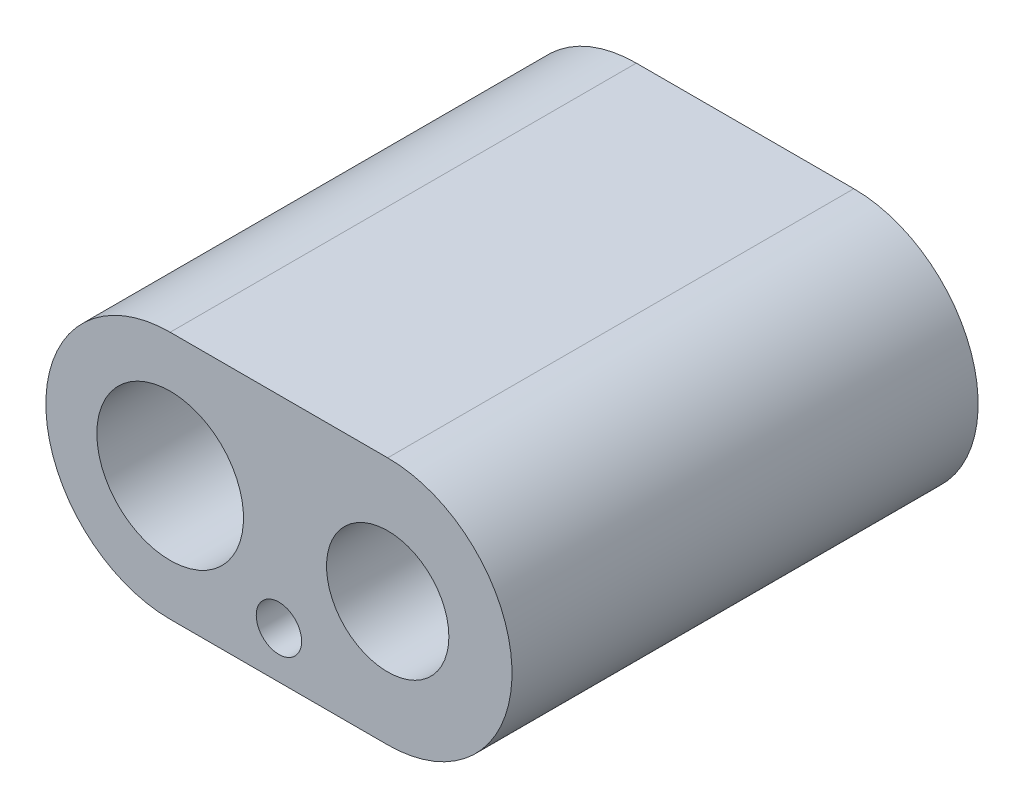
ISO-10303-21;
HEADER;
FILE_DESCRIPTION(('STEP AP214'),'2;1');
FILE_NAME('part.step','',(''),(''),'','','');
FILE_SCHEMA(('AUTOMOTIVE_DESIGN { 1 0 10303 214 1 1 1 1 }'));
ENDSEC;
DATA;
#1=APPLICATION_CONTEXT('core data for automotive mechanical design processes');
#2=APPLICATION_PROTOCOL_DEFINITION('international standard','automotive_design',2000,#1);
#3=PRODUCT_CONTEXT('',#1,'mechanical');
#4=PRODUCT('Part','Part','',(#3));
#5=PRODUCT_RELATED_PRODUCT_CATEGORY('part','',(#4));
#6=PRODUCT_DEFINITION_FORMATION('','',#4);
#7=PRODUCT_DEFINITION_CONTEXT('part definition',#1,'design');
#8=PRODUCT_DEFINITION('design','',#6,#7);
#9=PRODUCT_DEFINITION_SHAPE('','',#8);
#10=(LENGTH_UNIT() NAMED_UNIT(*) SI_UNIT(.MILLI.,.METRE.));
#11=(NAMED_UNIT(*) PLANE_ANGLE_UNIT() SI_UNIT($,.RADIAN.));
#12=(NAMED_UNIT(*) SI_UNIT($,.STERADIAN.) SOLID_ANGLE_UNIT());
#13=UNCERTAINTY_MEASURE_WITH_UNIT(LENGTH_MEASURE(1.E-05),#10,'distance_accuracy_value','');
#14=(GEOMETRIC_REPRESENTATION_CONTEXT(3) GLOBAL_UNCERTAINTY_ASSIGNED_CONTEXT((#13)) GLOBAL_UNIT_ASSIGNED_CONTEXT((#10,
#11,#12)) REPRESENTATION_CONTEXT('',''));
#15=CARTESIAN_POINT('',(0.,0.,0.));
#16=DIRECTION('',(0.,0.,1.));
#17=DIRECTION('',(1.,0.,0.));
#18=AXIS2_PLACEMENT_3D('',#15,#16,#17);
#19=CARTESIAN_POINT('',(8.89,0.,19.05));
#20=DIRECTION('',(0.,0.,-1.));
#21=DIRECTION('',(-1.,0.,0.));
#22=AXIS2_PLACEMENT_3D('',#19,#20,#21);
#23=CYLINDRICAL_SURFACE('',#22,1.5875);
#24=CARTESIAN_POINT('',(8.89,0.,0.));
#25=DIRECTION('',(0.,0.,1.));
#26=DIRECTION('',(1.,0.,0.));
#27=AXIS2_PLACEMENT_3D('',#24,#25,#26);
#28=CIRCLE('',#27,1.5875);
#29=CARTESIAN_POINT('',(7.3025,0.,0.));
#30=VERTEX_POINT('',#29);
#31=EDGE_CURVE('E127',#30,#30,#28,.T.);
#32=CARTESIAN_POINT('',(8.89,0.,13.5017146851374));
#33=DIRECTION('',(0.,0.,-1.));
#34=DIRECTION('',(-1.,0.,0.));
#35=AXIS2_PLACEMENT_3D('',#32,#33,#34);
#36=CIRCLE('',#35,1.5875);
#37=CARTESIAN_POINT('',(7.3025,0.,13.5017146851374));
#38=VERTEX_POINT('',#37);
#39=EDGE_CURVE('E141',#38,#38,#36,.T.);
#40=CARTESIAN_POINT('',(7.3025,0.,0.));
#41=CARTESIAN_POINT('',(7.3025,0.,0.140642861303514));
#42=CARTESIAN_POINT('',(7.3025,0.,0.281285722607029));
#43=CARTESIAN_POINT('',(7.3025,0.,0.562571445214058));
#44=CARTESIAN_POINT('',(7.3025,0.,0.703214306517572));
#45=CARTESIAN_POINT('',(7.3025,0.,0.9845000291246));
#46=CARTESIAN_POINT('',(7.3025,0.,1.12514289042811));
#47=CARTESIAN_POINT('',(7.3025,0.,1.40642861303514));
#48=CARTESIAN_POINT('',(7.3025,0.,1.54707147433866));
#49=CARTESIAN_POINT('',(7.3025,0.,1.82835719694568));
#50=CARTESIAN_POINT('',(7.3025,0.,1.9690000582492));
#51=CARTESIAN_POINT('',(7.3025,0.,2.25028578085623));
#52=CARTESIAN_POINT('',(7.3025,0.,2.39092864215974));
#53=CARTESIAN_POINT('',(7.3025,0.,2.67221436476677));
#54=CARTESIAN_POINT('',(7.3025,0.,2.81285722607028));
#55=CARTESIAN_POINT('',(7.3025,0.,3.09414294867731));
#56=CARTESIAN_POINT('',(7.3025,0.,3.23478580998083));
#57=CARTESIAN_POINT('',(7.3025,0.,3.51607153258785));
#58=CARTESIAN_POINT('',(7.3025,0.,3.65671439389137));
#59=CARTESIAN_POINT('',(7.3025,0.,3.9380001164984));
#60=CARTESIAN_POINT('',(7.3025,0.,4.07864297780191));
#61=CARTESIAN_POINT('',(7.3025,0.,4.35992870040894));
#62=CARTESIAN_POINT('',(7.3025,0.,4.50057156171245));
#63=CARTESIAN_POINT('',(7.3025,0.,4.78185728431948));
#64=CARTESIAN_POINT('',(7.3025,0.,4.92250014562299));
#65=CARTESIAN_POINT('',(7.3025,0.,5.20378586823002));
#66=CARTESIAN_POINT('',(7.3025,0.,5.34442872953354));
#67=CARTESIAN_POINT('',(7.3025,0.,5.62571445214057));
#68=CARTESIAN_POINT('',(7.3025,0.,5.76635731344408));
#69=CARTESIAN_POINT('',(7.3025,0.,6.04764303605111));
#70=CARTESIAN_POINT('',(7.3025,0.,6.18828589735462));
#71=CARTESIAN_POINT('',(7.3025,0.,6.46957161996165));
#72=CARTESIAN_POINT('',(7.3025,0.,6.61021448126516));
#73=CARTESIAN_POINT('',(7.3025,0.,6.89150020387219));
#74=CARTESIAN_POINT('',(7.3025,0.,7.03214306517571));
#75=CARTESIAN_POINT('',(7.3025,0.,7.31342878778274));
#76=CARTESIAN_POINT('',(7.3025,0.,7.45407164908625));
#77=CARTESIAN_POINT('',(7.3025,0.,7.73535737169328));
#78=CARTESIAN_POINT('',(7.3025,0.,7.87600023299679));
#79=CARTESIAN_POINT('',(7.3025,0.,8.15728595560382));
#80=CARTESIAN_POINT('',(7.3025,0.,8.29792881690734));
#81=CARTESIAN_POINT('',(7.3025,0.,8.57921453951436));
#82=CARTESIAN_POINT('',(7.3025,0.,8.71985740081788));
#83=CARTESIAN_POINT('',(7.3025,0.,9.00114312342491));
#84=CARTESIAN_POINT('',(7.3025,0.,9.14178598472842));
#85=CARTESIAN_POINT('',(7.3025,0.,9.42307170733545));
#86=CARTESIAN_POINT('',(7.3025,0.,9.56371456863896));
#87=CARTESIAN_POINT('',(7.3025,0.,9.84500029124599));
#88=CARTESIAN_POINT('',(7.3025,0.,9.98564315254951));
#89=CARTESIAN_POINT('',(7.3025,0.,10.2669288751565));
#90=CARTESIAN_POINT('',(7.3025,0.,10.40757173646));
#91=CARTESIAN_POINT('',(7.3025,0.,10.6888574590671));
#92=CARTESIAN_POINT('',(7.3025,0.,10.8295003203706));
#93=CARTESIAN_POINT('',(7.3025,0.,11.1107860429776));
#94=CARTESIAN_POINT('',(7.3025,0.,11.2514289042811));
#95=CARTESIAN_POINT('',(7.3025,0.,11.5327146268882));
#96=CARTESIAN_POINT('',(7.3025,0.,11.6733574881917));
#97=CARTESIAN_POINT('',(7.3025,0.,11.9546432107987));
#98=CARTESIAN_POINT('',(7.3025,0.,12.0952860721022));
#99=CARTESIAN_POINT('',(7.3025,0.,12.3765717947092));
#100=CARTESIAN_POINT('',(7.3025,0.,12.5172146560128));
#101=CARTESIAN_POINT('',(7.3025,0.,12.7985003786198));
#102=CARTESIAN_POINT('',(7.3025,0.,12.9391432399233));
#103=CARTESIAN_POINT('',(7.3025,0.,13.2204289625303));
#104=CARTESIAN_POINT('',(7.3025,0.,13.3610718238338));
#105=CARTESIAN_POINT('',(7.3025,0.,13.5017146851374));
#106=B_SPLINE_CURVE_WITH_KNOTS('',3,(#40,#41,#42,#43,#44,#45,#46,#47,#48,#49,#50,#51,#52,#53,
#54,#55,#56,#57,#58,#59,#60,#61,#62,#63,#64,#65,#66,#67,#68,#69,#70,#71,#72,#73,#74,#75,#76,#77,
#78,#79,#80,#81,#82,#83,#84,#85,#86,#87,#88,#89,#90,#91,#92,#93,#94,#95,#96,#97,#98,#99,#100,
#101,#102,#103,#104,#105),.UNSPECIFIED.,.F.,.F.,(4,2,2,2,2,2,2,2,2,2,2,2,2,2,2,2,2,2,2,2,2,2,2,
2,2,2,2,2,2,2,2,2,4),(0.,0.421928583910543,0.843857167821087,1.26578575173163,1.68771433564217,
2.10964291955271,2.53157150346325,2.9535000873738,3.37542867128434,3.79735725519488,
4.21928583910542,4.64121442301597,5.06314300692651,5.48507159083705,5.90700017474759,
6.32892875865814,6.75085734256868,7.17278592647922,7.59471451038976,8.01664309430031,
8.43857167821085,8.86050026212139,9.28242884603193,9.70435742994248,10.126286013853,
10.5482145977636,10.9701431816741,11.3920717655846,11.8140003494952,12.2359289334057,
12.6578575173163,13.0797861012268,13.5017146851374),.UNSPECIFIED.);
#107=EDGE_CURVE('BSEAM44',#30,#38,#106,.T.);
#108=ORIENTED_EDGE('',*,*,#31,.F.);
#109=ORIENTED_EDGE('',*,*,#39,.F.);
#110=ORIENTED_EDGE('',*,*,#107,.T.);
#111=ORIENTED_EDGE('',*,*,#107,.F.);
#112=EDGE_LOOP('',(#108,#110,#109,#111));
#113=FACE_BOUND('',#112,.T.);
#114=ADVANCED_FACE('F44',(#113),#23,.F.);
#115=CARTESIAN_POINT('',(0.,0.,19.05));
#116=DIRECTION('',(0.,0.,1.));
#117=DIRECTION('',(1.,0.,0.));
#118=AXIS2_PLACEMENT_3D('',#115,#116,#117);
#119=PLANE('',#118);
#120=CARTESIAN_POINT('',(8.89,0.,19.05));
#121=DIRECTION('',(0.,0.,1.));
#122=DIRECTION('',(1.,0.,0.));
#123=AXIS2_PLACEMENT_3D('',#120,#121,#122);
#124=CIRCLE('',#123,2.5);
#125=CARTESIAN_POINT('',(11.39,0.,19.05));
#126=VERTEX_POINT('',#125);
#127=EDGE_CURVE('E136',#126,#126,#124,.T.);
#128=ORIENTED_EDGE('',*,*,#127,.F.);
#129=EDGE_LOOP('',(#128));
#130=FACE_BOUND('',#129,.T.);
#131=CARTESIAN_POINT('',(0.,0.,19.05));
#132=DIRECTION('',(0.,0.,1.));
#133=DIRECTION('',(1.,0.,0.));
#134=AXIS2_PLACEMENT_3D('',#131,#132,#133);
#135=CIRCLE('',#134,5.08);
#136=CARTESIAN_POINT('',(0.,5.08,19.05));
#137=VERTEX_POINT('',#136);
#138=CARTESIAN_POINT('',(0.,-5.08,19.05));
#139=VERTEX_POINT('',#138);
#140=EDGE_CURVE('E97',#137,#139,#135,.T.);
#141=ORIENTED_EDGE('',*,*,#140,.T.);
#142=DIRECTION('',(1.,0.,0.));
#143=VECTOR('',#142,1.);
#144=CARTESIAN_POINT('',(0.,-5.08,19.05));
#145=LINE('',#144,#143);
#146=CARTESIAN_POINT('',(8.89,-5.08,19.05));
#147=VERTEX_POINT('',#146);
#148=EDGE_CURVE('E91',#139,#147,#145,.T.);
#149=ORIENTED_EDGE('',*,*,#148,.T.);
#150=CARTESIAN_POINT('',(8.89,0.,19.05));
#151=DIRECTION('',(0.,0.,1.));
#152=DIRECTION('',(1.,0.,0.));
#153=AXIS2_PLACEMENT_3D('',#150,#151,#152);
#154=CIRCLE('',#153,5.08);
#155=CARTESIAN_POINT('',(8.89,5.08,19.05));
#156=VERTEX_POINT('',#155);
#157=EDGE_CURVE('E95',#147,#156,#154,.T.);
#158=ORIENTED_EDGE('',*,*,#157,.T.);
#159=DIRECTION('',(-1.,0.,0.));
#160=VECTOR('',#159,1.);
#161=CARTESIAN_POINT('',(0.,5.08,19.05));
#162=LINE('',#161,#160);
#163=EDGE_CURVE('E61',#156,#137,#162,.T.);
#164=ORIENTED_EDGE('',*,*,#163,.T.);
#165=EDGE_LOOP('',(#141,#149,#158,#164));
#166=FACE_BOUND('',#165,.T.);
#167=CARTESIAN_POINT('',(0.,0.,19.05));
#168=DIRECTION('',(0.,0.,1.));
#169=DIRECTION('',(1.,0.,0.));
#170=AXIS2_PLACEMENT_3D('',#167,#168,#169);
#171=CIRCLE('',#170,2.9972);
#172=CARTESIAN_POINT('',(-2.9972,0.,19.05));
#173=VERTEX_POINT('',#172);
#174=EDGE_CURVE('E112',#173,#173,#171,.T.);
#175=ORIENTED_EDGE('',*,*,#174,.F.);
#176=EDGE_LOOP('',(#175));
#177=FACE_BOUND('',#176,.T.);
#178=CARTESIAN_POINT('',(4.445,-3.175,19.05));
#179=DIRECTION('',(0.,0.,1.));
#180=DIRECTION('',(1.,0.,0.));
#181=AXIS2_PLACEMENT_3D('',#178,#179,#180);
#182=CIRCLE('',#181,0.9271);
#183=CARTESIAN_POINT('',(3.5179,-3.175,19.05));
#184=VERTEX_POINT('',#183);
#185=EDGE_CURVE('E132',#184,#184,#182,.T.);
#186=ORIENTED_EDGE('',*,*,#185,.F.);
#187=EDGE_LOOP('',(#186));
#188=FACE_BOUND('',#187,.T.);
#189=ADVANCED_FACE('F92',(#130,#166,#177,#188),#119,.T.);
#190=CARTESIAN_POINT('',(0.,0.,0.));
#191=DIRECTION('',(0.,0.,1.));
#192=DIRECTION('',(1.,0.,0.));
#193=AXIS2_PLACEMENT_3D('',#190,#191,#192);
#194=PLANE('',#193);
#195=ORIENTED_EDGE('',*,*,#31,.T.);
#196=EDGE_LOOP('',(#195));
#197=FACE_BOUND('',#196,.T.);
#198=CARTESIAN_POINT('',(0.,0.,0.));
#199=DIRECTION('',(0.,0.,1.));
#200=DIRECTION('',(1.,0.,0.));
#201=AXIS2_PLACEMENT_3D('',#198,#199,#200);
#202=CIRCLE('',#201,5.08);
#203=CARTESIAN_POINT('',(0.,5.08,0.));
#204=VERTEX_POINT('',#203);
#205=CARTESIAN_POINT('',(0.,-5.08,0.));
#206=VERTEX_POINT('',#205);
#207=EDGE_CURVE('E109',#204,#206,#202,.T.);
#208=ORIENTED_EDGE('',*,*,#207,.F.);
#209=DIRECTION('',(-1.,0.,0.));
#210=VECTOR('',#209,1.);
#211=CARTESIAN_POINT('',(0.,5.08,0.));
#212=LINE('',#211,#210);
#213=CARTESIAN_POINT('',(8.89,5.08,0.));
#214=VERTEX_POINT('',#213);
#215=EDGE_CURVE('E84',#214,#204,#212,.T.);
#216=ORIENTED_EDGE('',*,*,#215,.F.);
#217=CARTESIAN_POINT('',(8.89,0.,0.));
#218=DIRECTION('',(0.,0.,1.));
#219=DIRECTION('',(1.,0.,0.));
#220=AXIS2_PLACEMENT_3D('',#217,#218,#219);
#221=CIRCLE('',#220,5.08);
#222=CARTESIAN_POINT('',(8.89,-5.08,0.));
#223=VERTEX_POINT('',#222);
#224=EDGE_CURVE('E78',#223,#214,#221,.T.);
#225=ORIENTED_EDGE('',*,*,#224,.F.);
#226=DIRECTION('',(1.,0.,0.));
#227=VECTOR('',#226,1.);
#228=CARTESIAN_POINT('',(0.,-5.08,0.));
#229=LINE('',#228,#227);
#230=EDGE_CURVE('E101',#206,#223,#229,.T.);
#231=ORIENTED_EDGE('',*,*,#230,.F.);
#232=EDGE_LOOP('',(#208,#216,#225,#231));
#233=FACE_BOUND('',#232,.T.);
#234=CARTESIAN_POINT('',(0.,0.,0.));
#235=DIRECTION('',(0.,0.,1.));
#236=DIRECTION('',(1.,0.,0.));
#237=AXIS2_PLACEMENT_3D('',#234,#235,#236);
#238=CIRCLE('',#237,2.9972);
#239=CARTESIAN_POINT('',(-2.9972,0.,0.));
#240=VERTEX_POINT('',#239);
#241=EDGE_CURVE('E124',#240,#240,#238,.T.);
#242=ORIENTED_EDGE('',*,*,#241,.T.);
#243=EDGE_LOOP('',(#242));
#244=FACE_BOUND('',#243,.T.);
#245=CARTESIAN_POINT('',(4.445,-3.175,0.));
#246=DIRECTION('',(0.,0.,1.));
#247=DIRECTION('',(1.,0.,0.));
#248=AXIS2_PLACEMENT_3D('',#245,#246,#247);
#249=CIRCLE('',#248,0.9271);
#250=CARTESIAN_POINT('',(3.5179,-3.175,0.));
#251=VERTEX_POINT('',#250);
#252=EDGE_CURVE('E133',#251,#251,#249,.T.);
#253=ORIENTED_EDGE('',*,*,#252,.T.);
#254=EDGE_LOOP('',(#253));
#255=FACE_BOUND('',#254,.T.);
#256=ADVANCED_FACE('F120',(#197,#233,#244,#255),#194,.F.);
#257=CARTESIAN_POINT('',(0.,0.,19.05));
#258=DIRECTION('',(0.,0.,-1.));
#259=DIRECTION('',(-1.,0.,0.));
#260=AXIS2_PLACEMENT_3D('',#257,#258,#259);
#261=CYLINDRICAL_SURFACE('',#260,5.08);
#262=ORIENTED_EDGE('',*,*,#207,.T.);
#263=DIRECTION('',(0.,0.,-1.));
#264=VECTOR('',#263,1.);
#265=CARTESIAN_POINT('',(0.,-5.08,19.05));
#266=LINE('',#265,#264);
#267=EDGE_CURVE('E13',#139,#206,#266,.T.);
#268=ORIENTED_EDGE('',*,*,#267,.F.);
#269=ORIENTED_EDGE('',*,*,#140,.F.);
#270=DIRECTION('',(0.,0.,-1.));
#271=VECTOR('',#270,1.);
#272=CARTESIAN_POINT('',(0.,5.08,19.05));
#273=LINE('',#272,#271);
#274=EDGE_CURVE('E105',#137,#204,#273,.T.);
#275=ORIENTED_EDGE('',*,*,#274,.T.);
#276=EDGE_LOOP('',(#262,#268,#269,#275));
#277=FACE_BOUND('',#276,.T.);
#278=ADVANCED_FACE('F46',(#277),#261,.T.);
#279=CARTESIAN_POINT('',(0.,-5.08,19.05));
#280=DIRECTION('',(0.,1.,0.));
#281=DIRECTION('',(0.,0.,1.));
#282=AXIS2_PLACEMENT_3D('',#279,#280,#281);
#283=PLANE('',#282);
#284=ORIENTED_EDGE('',*,*,#230,.T.);
#285=DIRECTION('',(0.,0.,-1.));
#286=VECTOR('',#285,1.);
#287=CARTESIAN_POINT('',(8.89,-5.08,19.05));
#288=LINE('',#287,#286);
#289=EDGE_CURVE('E53',#147,#223,#288,.T.);
#290=ORIENTED_EDGE('',*,*,#289,.F.);
#291=ORIENTED_EDGE('',*,*,#148,.F.);
#292=ORIENTED_EDGE('',*,*,#267,.T.);
#293=EDGE_LOOP('',(#284,#290,#291,#292));
#294=FACE_BOUND('',#293,.T.);
#295=ADVANCED_FACE('F100',(#294),#283,.F.);
#296=CARTESIAN_POINT('',(8.89,0.,19.05));
#297=DIRECTION('',(0.,0.,-1.));
#298=DIRECTION('',(-1.,0.,0.));
#299=AXIS2_PLACEMENT_3D('',#296,#297,#298);
#300=CYLINDRICAL_SURFACE('',#299,5.08);
#301=ORIENTED_EDGE('',*,*,#224,.T.);
#302=DIRECTION('',(0.,0.,-1.));
#303=VECTOR('',#302,1.);
#304=CARTESIAN_POINT('',(8.89,5.08,19.05));
#305=LINE('',#304,#303);
#306=EDGE_CURVE('E102',#156,#214,#305,.T.);
#307=ORIENTED_EDGE('',*,*,#306,.F.);
#308=ORIENTED_EDGE('',*,*,#157,.F.);
#309=ORIENTED_EDGE('',*,*,#289,.T.);
#310=EDGE_LOOP('',(#301,#307,#308,#309));
#311=FACE_BOUND('',#310,.T.);
#312=ADVANCED_FACE('F103',(#311),#300,.T.);
#313=CARTESIAN_POINT('',(0.,5.08,19.05));
#314=DIRECTION('',(0.,-1.,0.));
#315=DIRECTION('',(0.,0.,-1.));
#316=AXIS2_PLACEMENT_3D('',#313,#314,#315);
#317=PLANE('',#316);
#318=ORIENTED_EDGE('',*,*,#215,.T.);
#319=ORIENTED_EDGE('',*,*,#274,.F.);
#320=ORIENTED_EDGE('',*,*,#163,.F.);
#321=ORIENTED_EDGE('',*,*,#306,.T.);
#322=EDGE_LOOP('',(#318,#319,#320,#321));
#323=FACE_BOUND('',#322,.T.);
#324=ADVANCED_FACE('F117',(#323),#317,.F.);
#325=CARTESIAN_POINT('',(0.,0.,19.05));
#326=DIRECTION('',(0.,0.,-1.));
#327=DIRECTION('',(-1.,0.,0.));
#328=AXIS2_PLACEMENT_3D('',#325,#326,#327);
#329=CYLINDRICAL_SURFACE('',#328,2.9972);
#330=CARTESIAN_POINT('',(-2.9972,0.,19.05));
#331=CARTESIAN_POINT('',(-2.9972,0.,18.8515625));
#332=CARTESIAN_POINT('',(-2.9972,0.,18.653125));
#333=CARTESIAN_POINT('',(-2.9972,0.,18.25625));
#334=CARTESIAN_POINT('',(-2.9972,0.,18.0578125));
#335=CARTESIAN_POINT('',(-2.9972,0.,17.6609375));
#336=CARTESIAN_POINT('',(-2.9972,0.,17.4625));
#337=CARTESIAN_POINT('',(-2.9972,0.,17.065625));
#338=CARTESIAN_POINT('',(-2.9972,0.,16.8671875));
#339=CARTESIAN_POINT('',(-2.9972,0.,16.4703125));
#340=CARTESIAN_POINT('',(-2.9972,0.,16.271875));
#341=CARTESIAN_POINT('',(-2.9972,0.,15.875));
#342=CARTESIAN_POINT('',(-2.9972,0.,15.6765625));
#343=CARTESIAN_POINT('',(-2.9972,0.,15.2796875));
#344=CARTESIAN_POINT('',(-2.9972,0.,15.08125));
#345=CARTESIAN_POINT('',(-2.9972,0.,14.684375));
#346=CARTESIAN_POINT('',(-2.9972,0.,14.4859375));
#347=CARTESIAN_POINT('',(-2.9972,0.,14.0890625));
#348=CARTESIAN_POINT('',(-2.9972,0.,13.890625));
#349=CARTESIAN_POINT('',(-2.9972,0.,13.49375));
#350=CARTESIAN_POINT('',(-2.9972,0.,13.2953125));
#351=CARTESIAN_POINT('',(-2.9972,0.,12.8984375));
#352=CARTESIAN_POINT('',(-2.9972,0.,12.7));
#353=CARTESIAN_POINT('',(-2.9972,0.,12.303125));
#354=CARTESIAN_POINT('',(-2.9972,0.,12.1046875));
#355=CARTESIAN_POINT('',(-2.9972,0.,11.7078125));
#356=CARTESIAN_POINT('',(-2.9972,0.,11.509375));
#357=CARTESIAN_POINT('',(-2.9972,0.,11.1125));
#358=CARTESIAN_POINT('',(-2.9972,0.,10.9140625));
#359=CARTESIAN_POINT('',(-2.9972,0.,10.5171875));
#360=CARTESIAN_POINT('',(-2.9972,0.,10.31875));
#361=CARTESIAN_POINT('',(-2.9972,0.,9.921875));
#362=CARTESIAN_POINT('',(-2.9972,0.,9.7234375));
#363=CARTESIAN_POINT('',(-2.9972,0.,9.3265625));
#364=CARTESIAN_POINT('',(-2.9972,0.,9.128125));
#365=CARTESIAN_POINT('',(-2.9972,0.,8.73125));
#366=CARTESIAN_POINT('',(-2.9972,0.,8.5328125));
#367=CARTESIAN_POINT('',(-2.9972,0.,8.1359375));
#368=CARTESIAN_POINT('',(-2.9972,0.,7.9375));
#369=CARTESIAN_POINT('',(-2.9972,0.,7.540625));
#370=CARTESIAN_POINT('',(-2.9972,0.,7.3421875));
#371=CARTESIAN_POINT('',(-2.9972,0.,6.9453125));
#372=CARTESIAN_POINT('',(-2.9972,0.,6.746875));
#373=CARTESIAN_POINT('',(-2.9972,0.,6.35));
#374=CARTESIAN_POINT('',(-2.9972,0.,6.1515625));
#375=CARTESIAN_POINT('',(-2.9972,0.,5.7546875));
#376=CARTESIAN_POINT('',(-2.9972,0.,5.55625));
#377=CARTESIAN_POINT('',(-2.9972,0.,5.159375));
#378=CARTESIAN_POINT('',(-2.9972,0.,4.9609375));
#379=CARTESIAN_POINT('',(-2.9972,0.,4.5640625));
#380=CARTESIAN_POINT('',(-2.9972,0.,4.365625));
#381=CARTESIAN_POINT('',(-2.9972,0.,3.96875));
#382=CARTESIAN_POINT('',(-2.9972,0.,3.7703125));
#383=CARTESIAN_POINT('',(-2.9972,0.,3.3734375));
#384=CARTESIAN_POINT('',(-2.9972,0.,3.175));
#385=CARTESIAN_POINT('',(-2.9972,0.,2.778125));
#386=CARTESIAN_POINT('',(-2.9972,0.,2.5796875));
#387=CARTESIAN_POINT('',(-2.9972,0.,2.1828125));
#388=CARTESIAN_POINT('',(-2.9972,0.,1.984375));
#389=CARTESIAN_POINT('',(-2.9972,0.,1.5875));
#390=CARTESIAN_POINT('',(-2.9972,0.,1.3890625));
#391=CARTESIAN_POINT('',(-2.9972,0.,0.992187500000001));
#392=CARTESIAN_POINT('',(-2.9972,0.,0.793750000000001));
#393=CARTESIAN_POINT('',(-2.9972,0.,0.396875));
#394=CARTESIAN_POINT('',(-2.9972,0.,0.1984375));
#395=CARTESIAN_POINT('',(-2.9972,0.,0.));
#396=B_SPLINE_CURVE_WITH_KNOTS('',3,(#330,#331,#332,#333,#334,#335,#336,#337,#338,#339,#340,
#341,#342,#343,#344,#345,#346,#347,#348,#349,#350,#351,#352,#353,#354,#355,#356,#357,#358,#359,
#360,#361,#362,#363,#364,#365,#366,#367,#368,#369,#370,#371,#372,#373,#374,#375,#376,#377,#378,
#379,#380,#381,#382,#383,#384,#385,#386,#387,#388,#389,#390,#391,#392,#393,#394,#395),
.UNSPECIFIED.,.F.,.F.,(4,2,2,2,2,2,2,2,2,2,2,2,2,2,2,2,2,2,2,2,2,2,2,2,2,2,2,2,2,2,2,2,4),(0.,
0.595312499999997,1.190625,1.7859375,2.38125,2.9765625,3.571875,4.1671875,4.7625,5.3578125,
5.953125,6.5484375,7.14375,7.7390625,8.334375,8.9296875,9.525,10.1203125,10.715625,11.3109375,
11.90625,12.5015625,13.096875,13.6921875,14.2875,14.8828125,15.478125,16.0734375,16.66875,
17.2640625,17.859375,18.4546875,19.05),.UNSPECIFIED.);
#397=EDGE_CURVE('BSEAM174',#173,#240,#396,.T.);
#398=ORIENTED_EDGE('',*,*,#174,.T.);
#399=ORIENTED_EDGE('',*,*,#241,.F.);
#400=ORIENTED_EDGE('',*,*,#397,.T.);
#401=ORIENTED_EDGE('',*,*,#397,.F.);
#402=EDGE_LOOP('',(#398,#400,#399,#401));
#403=FACE_BOUND('',#402,.T.);
#404=ADVANCED_FACE('F174',(#403),#329,.F.);
#405=CARTESIAN_POINT('',(4.445,-3.175,19.05));
#406=DIRECTION('',(0.,0.,-1.));
#407=DIRECTION('',(-1.,0.,0.));
#408=AXIS2_PLACEMENT_3D('',#405,#406,#407);
#409=CYLINDRICAL_SURFACE('',#408,0.9271);
#410=CARTESIAN_POINT('',(3.5179,-3.175,19.05));
#411=CARTESIAN_POINT('',(3.5179,-3.175,18.8515625));
#412=CARTESIAN_POINT('',(3.5179,-3.175,18.653125));
#413=CARTESIAN_POINT('',(3.5179,-3.175,18.25625));
#414=CARTESIAN_POINT('',(3.5179,-3.175,18.0578125));
#415=CARTESIAN_POINT('',(3.5179,-3.175,17.6609375));
#416=CARTESIAN_POINT('',(3.5179,-3.175,17.4625));
#417=CARTESIAN_POINT('',(3.5179,-3.175,17.065625));
#418=CARTESIAN_POINT('',(3.5179,-3.175,16.8671875));
#419=CARTESIAN_POINT('',(3.5179,-3.175,16.4703125));
#420=CARTESIAN_POINT('',(3.5179,-3.175,16.271875));
#421=CARTESIAN_POINT('',(3.5179,-3.175,15.875));
#422=CARTESIAN_POINT('',(3.5179,-3.175,15.6765625));
#423=CARTESIAN_POINT('',(3.5179,-3.175,15.2796875));
#424=CARTESIAN_POINT('',(3.5179,-3.175,15.08125));
#425=CARTESIAN_POINT('',(3.5179,-3.175,14.684375));
#426=CARTESIAN_POINT('',(3.5179,-3.175,14.4859375));
#427=CARTESIAN_POINT('',(3.5179,-3.175,14.0890625));
#428=CARTESIAN_POINT('',(3.5179,-3.175,13.890625));
#429=CARTESIAN_POINT('',(3.5179,-3.175,13.49375));
#430=CARTESIAN_POINT('',(3.5179,-3.175,13.2953125));
#431=CARTESIAN_POINT('',(3.5179,-3.175,12.8984375));
#432=CARTESIAN_POINT('',(3.5179,-3.175,12.7));
#433=CARTESIAN_POINT('',(3.5179,-3.175,12.303125));
#434=CARTESIAN_POINT('',(3.5179,-3.175,12.1046875));
#435=CARTESIAN_POINT('',(3.5179,-3.175,11.7078125));
#436=CARTESIAN_POINT('',(3.5179,-3.175,11.509375));
#437=CARTESIAN_POINT('',(3.5179,-3.175,11.1125));
#438=CARTESIAN_POINT('',(3.5179,-3.175,10.9140625));
#439=CARTESIAN_POINT('',(3.5179,-3.175,10.5171875));
#440=CARTESIAN_POINT('',(3.5179,-3.175,10.31875));
#441=CARTESIAN_POINT('',(3.5179,-3.175,9.921875));
#442=CARTESIAN_POINT('',(3.5179,-3.175,9.7234375));
#443=CARTESIAN_POINT('',(3.5179,-3.175,9.3265625));
#444=CARTESIAN_POINT('',(3.5179,-3.175,9.128125));
#445=CARTESIAN_POINT('',(3.5179,-3.175,8.73125));
#446=CARTESIAN_POINT('',(3.5179,-3.175,8.5328125));
#447=CARTESIAN_POINT('',(3.5179,-3.175,8.1359375));
#448=CARTESIAN_POINT('',(3.5179,-3.175,7.9375));
#449=CARTESIAN_POINT('',(3.5179,-3.175,7.540625));
#450=CARTESIAN_POINT('',(3.5179,-3.175,7.3421875));
#451=CARTESIAN_POINT('',(3.5179,-3.175,6.9453125));
#452=CARTESIAN_POINT('',(3.5179,-3.175,6.746875));
#453=CARTESIAN_POINT('',(3.5179,-3.175,6.35));
#454=CARTESIAN_POINT('',(3.5179,-3.175,6.1515625));
#455=CARTESIAN_POINT('',(3.5179,-3.175,5.7546875));
#456=CARTESIAN_POINT('',(3.5179,-3.175,5.55625));
#457=CARTESIAN_POINT('',(3.5179,-3.175,5.159375));
#458=CARTESIAN_POINT('',(3.5179,-3.175,4.9609375));
#459=CARTESIAN_POINT('',(3.5179,-3.175,4.5640625));
#460=CARTESIAN_POINT('',(3.5179,-3.175,4.365625));
#461=CARTESIAN_POINT('',(3.5179,-3.175,3.96875));
#462=CARTESIAN_POINT('',(3.5179,-3.175,3.7703125));
#463=CARTESIAN_POINT('',(3.5179,-3.175,3.3734375));
#464=CARTESIAN_POINT('',(3.5179,-3.175,3.175));
#465=CARTESIAN_POINT('',(3.5179,-3.175,2.778125));
#466=CARTESIAN_POINT('',(3.5179,-3.175,2.5796875));
#467=CARTESIAN_POINT('',(3.5179,-3.175,2.1828125));
#468=CARTESIAN_POINT('',(3.5179,-3.175,1.984375));
#469=CARTESIAN_POINT('',(3.5179,-3.175,1.5875));
#470=CARTESIAN_POINT('',(3.5179,-3.175,1.3890625));
#471=CARTESIAN_POINT('',(3.5179,-3.175,0.992187500000001));
#472=CARTESIAN_POINT('',(3.5179,-3.175,0.793750000000001));
#473=CARTESIAN_POINT('',(3.5179,-3.175,0.396875));
#474=CARTESIAN_POINT('',(3.5179,-3.175,0.1984375));
#475=CARTESIAN_POINT('',(3.5179,-3.175,0.));
#476=B_SPLINE_CURVE_WITH_KNOTS('',3,(#410,#411,#412,#413,#414,#415,#416,#417,#418,#419,#420,
#421,#422,#423,#424,#425,#426,#427,#428,#429,#430,#431,#432,#433,#434,#435,#436,#437,#438,#439,
#440,#441,#442,#443,#444,#445,#446,#447,#448,#449,#450,#451,#452,#453,#454,#455,#456,#457,#458,
#459,#460,#461,#462,#463,#464,#465,#466,#467,#468,#469,#470,#471,#472,#473,#474,#475),
.UNSPECIFIED.,.F.,.F.,(4,2,2,2,2,2,2,2,2,2,2,2,2,2,2,2,2,2,2,2,2,2,2,2,2,2,2,2,2,2,2,2,4),(0.,
0.5953125,1.190625,1.7859375,2.38125,2.9765625,3.571875,4.1671875,4.7625,5.3578125,5.953125,
6.5484375,7.14375,7.7390625,8.334375,8.9296875,9.525,10.1203125,10.715625,11.3109375,11.90625,
12.5015625,13.096875,13.6921875,14.2875,14.8828125,15.478125,16.0734375,16.66875,17.2640625,
17.859375,18.4546875,19.05),.UNSPECIFIED.);
#477=EDGE_CURVE('BSEAM159',#184,#251,#476,.T.);
#478=ORIENTED_EDGE('',*,*,#185,.T.);
#479=ORIENTED_EDGE('',*,*,#252,.F.);
#480=ORIENTED_EDGE('',*,*,#477,.T.);
#481=ORIENTED_EDGE('',*,*,#477,.F.);
#482=EDGE_LOOP('',(#478,#480,#479,#481));
#483=FACE_BOUND('',#482,.T.);
#484=ADVANCED_FACE('F159',(#483),#409,.F.);
#485=CARTESIAN_POINT('',(8.89,0.,14.05));
#486=DIRECTION('',(0.,0.,1.));
#487=DIRECTION('',(1.,0.,0.));
#488=AXIS2_PLACEMENT_3D('',#485,#486,#487);
#489=CYLINDRICAL_SURFACE('',#488,2.5);
#490=CARTESIAN_POINT('',(8.89,0.,14.05));
#491=DIRECTION('',(0.,0.,-1.));
#492=DIRECTION('',(-1.,0.,0.));
#493=AXIS2_PLACEMENT_3D('',#490,#491,#492);
#494=CIRCLE('',#493,2.5);
#495=CARTESIAN_POINT('',(6.39,0.,14.05));
#496=VERTEX_POINT('',#495);
#497=EDGE_CURVE('E144',#496,#496,#494,.T.);
#498=ORIENTED_EDGE('',*,*,#497,.T.);
#499=EDGE_LOOP('',(#498));
#500=FACE_BOUND('',#499,.T.);
#501=ORIENTED_EDGE('',*,*,#127,.T.);
#502=EDGE_LOOP('',(#501));
#503=FACE_BOUND('',#502,.T.);
#504=ADVANCED_FACE('F148',(#500,#503),#489,.F.);
#505=CARTESIAN_POINT('',(8.89,0.,14.05));
#506=DIRECTION('',(0.,0.,1.));
#507=DIRECTION('',(1.,0.,0.));
#508=AXIS2_PLACEMENT_3D('',#505,#506,#507);
#509=CONICAL_SURFACE('',#508,2.5,1.02974425867666);
#510=ORIENTED_EDGE('',*,*,#39,.T.);
#511=EDGE_LOOP('',(#510));
#512=FACE_BOUND('',#511,.T.);
#513=ORIENTED_EDGE('',*,*,#497,.F.);
#514=EDGE_LOOP('',(#513));
#515=FACE_BOUND('',#514,.T.);
#516=ADVANCED_FACE('F151',(#512,#515),#509,.F.);
#517=CLOSED_SHELL('',(#114,#189,#256,#278,#295,#312,#324,#404,#484,#504,#516));
#518=MANIFOLD_SOLID_BREP('B2',#517);
#519=ADVANCED_BREP_SHAPE_REPRESENTATION('',(#18,#518),#14);
#520=SHAPE_DEFINITION_REPRESENTATION(#9,#519);
ENDSEC;
END-ISO-10303-21;
